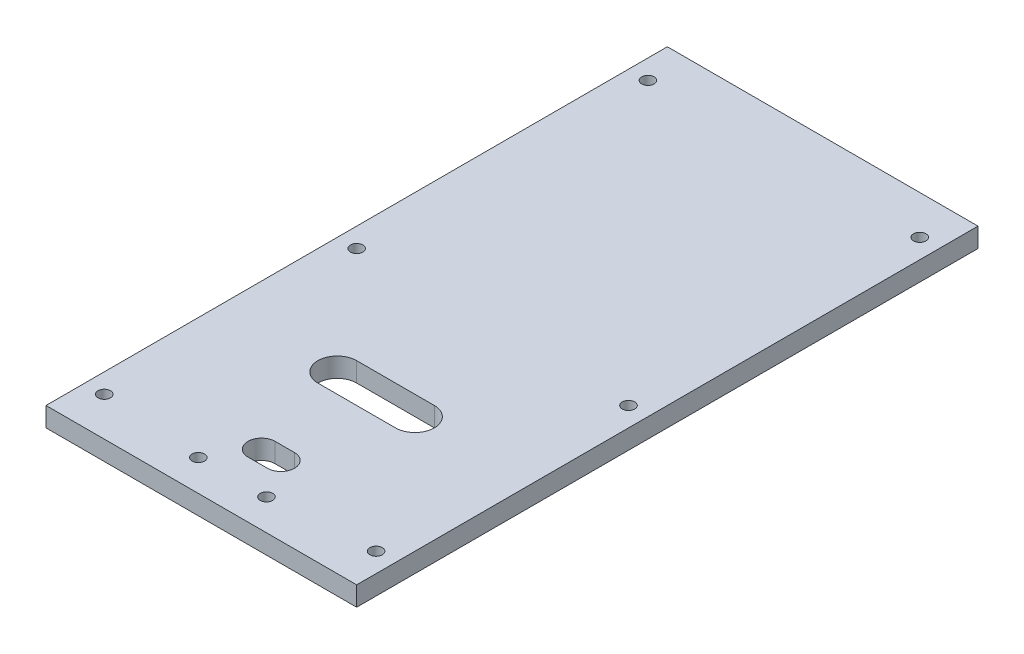
ISO-10303-21;
HEADER;
FILE_DESCRIPTION(('STEP AP214'),'2;1');
FILE_NAME('part.step','',(''),(''),'','','');
FILE_SCHEMA(('AUTOMOTIVE_DESIGN { 1 0 10303 214 1 1 1 1 }'));
ENDSEC;
DATA;
#1=APPLICATION_CONTEXT('core data for automotive mechanical design processes');
#2=APPLICATION_PROTOCOL_DEFINITION('international standard','automotive_design',2000,#1);
#3=PRODUCT_CONTEXT('',#1,'mechanical');
#4=PRODUCT('Part','Part','',(#3));
#5=PRODUCT_RELATED_PRODUCT_CATEGORY('part','',(#4));
#6=PRODUCT_DEFINITION_FORMATION('','',#4);
#7=PRODUCT_DEFINITION_CONTEXT('part definition',#1,'design');
#8=PRODUCT_DEFINITION('design','',#6,#7);
#9=PRODUCT_DEFINITION_SHAPE('','',#8);
#10=(LENGTH_UNIT() NAMED_UNIT(*) SI_UNIT(.MILLI.,.METRE.));
#11=(NAMED_UNIT(*) PLANE_ANGLE_UNIT() SI_UNIT($,.RADIAN.));
#12=(NAMED_UNIT(*) SI_UNIT($,.STERADIAN.) SOLID_ANGLE_UNIT());
#13=UNCERTAINTY_MEASURE_WITH_UNIT(LENGTH_MEASURE(1.E-05),#10,'distance_accuracy_value','');
#14=(GEOMETRIC_REPRESENTATION_CONTEXT(3) GLOBAL_UNCERTAINTY_ASSIGNED_CONTEXT((#13)) GLOBAL_UNIT_ASSIGNED_CONTEXT((#10,
#11,#12)) REPRESENTATION_CONTEXT('',''));
#15=CARTESIAN_POINT('',(0.,0.,0.));
#16=DIRECTION('',(0.,0.,1.));
#17=DIRECTION('',(1.,0.,0.));
#18=AXIS2_PLACEMENT_3D('',#15,#16,#17);
#19=CARTESIAN_POINT('',(0.,5.,0.));
#20=DIRECTION('',(1.,0.,0.));
#21=DIRECTION('',(0.,0.,-1.));
#22=AXIS2_PLACEMENT_3D('',#19,#20,#21);
#23=PLANE('',#22);
#24=DIRECTION('',(0.,0.,1.));
#25=VECTOR('',#24,1.);
#26=CARTESIAN_POINT('',(0.,0.,0.));
#27=LINE('',#26,#25);
#28=CARTESIAN_POINT('',(0.,0.,-160.));
#29=VERTEX_POINT('',#28);
#30=CARTESIAN_POINT('',(0.,0.,0.));
#31=VERTEX_POINT('',#30);
#32=EDGE_CURVE('E237',#29,#31,#27,.T.);
#33=ORIENTED_EDGE('',*,*,#32,.T.);
#34=DIRECTION('',(0.,-1.,0.));
#35=VECTOR('',#34,1.);
#36=CARTESIAN_POINT('',(0.,5.,0.));
#37=LINE('',#36,#35);
#38=CARTESIAN_POINT('',(0.,5.,0.));
#39=VERTEX_POINT('',#38);
#40=EDGE_CURVE('E11',#39,#31,#37,.T.);
#41=ORIENTED_EDGE('',*,*,#40,.F.);
#42=DIRECTION('',(0.,0.,1.));
#43=VECTOR('',#42,1.);
#44=CARTESIAN_POINT('',(0.,5.,0.));
#45=LINE('',#44,#43);
#46=CARTESIAN_POINT('',(0.,5.,-160.));
#47=VERTEX_POINT('',#46);
#48=EDGE_CURVE('E238',#47,#39,#45,.T.);
#49=ORIENTED_EDGE('',*,*,#48,.F.);
#50=DIRECTION('',(0.,-1.,0.));
#51=VECTOR('',#50,1.);
#52=CARTESIAN_POINT('',(0.,5.,-160.));
#53=LINE('',#52,#51);
#54=EDGE_CURVE('E248',#47,#29,#53,.T.);
#55=ORIENTED_EDGE('',*,*,#54,.T.);
#56=EDGE_LOOP('',(#33,#41,#49,#55));
#57=FACE_BOUND('',#56,.T.);
#58=ADVANCED_FACE('F32',(#57),#23,.F.);
#59=CARTESIAN_POINT('',(0.,5.,0.));
#60=DIRECTION('',(0.,0.,-1.));
#61=DIRECTION('',(-1.,0.,0.));
#62=AXIS2_PLACEMENT_3D('',#59,#60,#61);
#63=PLANE('',#62);
#64=DIRECTION('',(1.,0.,0.));
#65=VECTOR('',#64,1.);
#66=CARTESIAN_POINT('',(0.,0.,0.));
#67=LINE('',#66,#65);
#68=CARTESIAN_POINT('',(80.,0.,0.));
#69=VERTEX_POINT('',#68);
#70=EDGE_CURVE('E251',#31,#69,#67,.T.);
#71=ORIENTED_EDGE('',*,*,#70,.T.);
#72=DIRECTION('',(0.,-1.,0.));
#73=VECTOR('',#72,1.);
#74=CARTESIAN_POINT('',(80.,5.,0.));
#75=LINE('',#74,#73);
#76=CARTESIAN_POINT('',(80.,5.,0.));
#77=VERTEX_POINT('',#76);
#78=EDGE_CURVE('E39',#77,#69,#75,.T.);
#79=ORIENTED_EDGE('',*,*,#78,.F.);
#80=DIRECTION('',(1.,0.,0.));
#81=VECTOR('',#80,1.);
#82=CARTESIAN_POINT('',(0.,5.,0.));
#83=LINE('',#82,#81);
#84=EDGE_CURVE('E241',#39,#77,#83,.T.);
#85=ORIENTED_EDGE('',*,*,#84,.F.);
#86=ORIENTED_EDGE('',*,*,#40,.T.);
#87=EDGE_LOOP('',(#71,#79,#85,#86));
#88=FACE_BOUND('',#87,.T.);
#89=ADVANCED_FACE('F280',(#88),#63,.F.);
#90=CARTESIAN_POINT('',(80.,5.,0.));
#91=DIRECTION('',(-1.,0.,0.));
#92=DIRECTION('',(0.,0.,1.));
#93=AXIS2_PLACEMENT_3D('',#90,#91,#92);
#94=PLANE('',#93);
#95=DIRECTION('',(0.,0.,-1.));
#96=VECTOR('',#95,1.);
#97=CARTESIAN_POINT('',(80.,0.,0.));
#98=LINE('',#97,#96);
#99=CARTESIAN_POINT('',(80.,0.,-160.));
#100=VERTEX_POINT('',#99);
#101=EDGE_CURVE('E253',#69,#100,#98,.T.);
#102=ORIENTED_EDGE('',*,*,#101,.T.);
#103=DIRECTION('',(0.,-1.,0.));
#104=VECTOR('',#103,1.);
#105=CARTESIAN_POINT('',(80.,5.,-160.));
#106=LINE('',#105,#104);
#107=CARTESIAN_POINT('',(80.,5.,-160.));
#108=VERTEX_POINT('',#107);
#109=EDGE_CURVE('E258',#108,#100,#106,.T.);
#110=ORIENTED_EDGE('',*,*,#109,.F.);
#111=DIRECTION('',(0.,0.,-1.));
#112=VECTOR('',#111,1.);
#113=CARTESIAN_POINT('',(80.,5.,0.));
#114=LINE('',#113,#112);
#115=EDGE_CURVE('E244',#77,#108,#114,.T.);
#116=ORIENTED_EDGE('',*,*,#115,.F.);
#117=ORIENTED_EDGE('',*,*,#78,.T.);
#118=EDGE_LOOP('',(#102,#110,#116,#117));
#119=FACE_BOUND('',#118,.T.);
#120=ADVANCED_FACE('F265',(#119),#94,.F.);
#121=CARTESIAN_POINT('',(0.,5.,-160.));
#122=DIRECTION('',(0.,0.,1.));
#123=DIRECTION('',(1.,0.,0.));
#124=AXIS2_PLACEMENT_3D('',#121,#122,#123);
#125=PLANE('',#124);
#126=DIRECTION('',(-1.,0.,0.));
#127=VECTOR('',#126,1.);
#128=CARTESIAN_POINT('',(0.,0.,-160.));
#129=LINE('',#128,#127);
#130=EDGE_CURVE('E242',#100,#29,#129,.T.);
#131=ORIENTED_EDGE('',*,*,#130,.T.);
#132=ORIENTED_EDGE('',*,*,#54,.F.);
#133=DIRECTION('',(-1.,0.,0.));
#134=VECTOR('',#133,1.);
#135=CARTESIAN_POINT('',(0.,5.,-160.));
#136=LINE('',#135,#134);
#137=EDGE_CURVE('E246',#108,#47,#136,.T.);
#138=ORIENTED_EDGE('',*,*,#137,.F.);
#139=ORIENTED_EDGE('',*,*,#109,.T.);
#140=EDGE_LOOP('',(#131,#132,#138,#139));
#141=FACE_BOUND('',#140,.T.);
#142=ADVANCED_FACE('F273',(#141),#125,.F.);
#143=CARTESIAN_POINT('',(0.,5.,0.));
#144=DIRECTION('',(0.,-1.,0.));
#145=DIRECTION('',(0.,0.,-1.));
#146=AXIS2_PLACEMENT_3D('',#143,#144,#145);
#147=PLANE('',#146);
#148=DIRECTION('',(1.,0.,0.));
#149=VECTOR('',#148,1.);
#150=CARTESIAN_POINT('',(37.5,5.,-14.5));
#151=LINE('',#150,#149);
#152=CARTESIAN_POINT('',(37.5,5.,-14.5));
#153=VERTEX_POINT('',#152);
#154=CARTESIAN_POINT('',(42.5,5.,-14.5));
#155=VERTEX_POINT('',#154);
#156=EDGE_CURVE('E150',#153,#155,#151,.T.);
#157=ORIENTED_EDGE('',*,*,#156,.F.);
#158=CARTESIAN_POINT('',(37.5,5.,-18.));
#159=DIRECTION('',(0.,1.,0.));
#160=DIRECTION('',(0.,0.,1.));
#161=AXIS2_PLACEMENT_3D('',#158,#159,#160);
#162=CIRCLE('',#161,3.5);
#163=CARTESIAN_POINT('',(37.5,5.,-21.5));
#164=VERTEX_POINT('',#163);
#165=EDGE_CURVE('E46',#164,#153,#162,.T.);
#166=ORIENTED_EDGE('',*,*,#165,.F.);
#167=DIRECTION('',(-1.,0.,0.));
#168=VECTOR('',#167,1.);
#169=CARTESIAN_POINT('',(37.5,5.,-21.5));
#170=LINE('',#169,#168);
#171=CARTESIAN_POINT('',(42.5,5.,-21.5));
#172=VERTEX_POINT('',#171);
#173=EDGE_CURVE('E141',#172,#164,#170,.T.);
#174=ORIENTED_EDGE('',*,*,#173,.F.);
#175=CARTESIAN_POINT('',(42.5,5.,-18.));
#176=DIRECTION('',(0.,1.,0.));
#177=DIRECTION('',(0.,0.,1.));
#178=AXIS2_PLACEMENT_3D('',#175,#176,#177);
#179=CIRCLE('',#178,3.5);
#180=EDGE_CURVE('E144',#155,#172,#179,.T.);
#181=ORIENTED_EDGE('',*,*,#180,.F.);
#182=EDGE_LOOP('',(#157,#166,#174,#181));
#183=FACE_BOUND('',#182,.T.);
#184=DIRECTION('',(1.,0.,0.));
#185=VECTOR('',#184,1.);
#186=CARTESIAN_POINT('',(30.,5.,-40.));
#187=LINE('',#186,#185);
#188=CARTESIAN_POINT('',(30.,5.,-40.));
#189=VERTEX_POINT('',#188);
#190=CARTESIAN_POINT('',(50.,5.,-40.));
#191=VERTEX_POINT('',#190);
#192=EDGE_CURVE('E176',#189,#191,#187,.T.);
#193=ORIENTED_EDGE('',*,*,#192,.F.);
#194=CARTESIAN_POINT('',(30.,5.,-45.));
#195=DIRECTION('',(0.,1.,0.));
#196=DIRECTION('',(0.,0.,1.));
#197=AXIS2_PLACEMENT_3D('',#194,#195,#196);
#198=CIRCLE('',#197,5.00000000000001);
#199=CARTESIAN_POINT('',(30.,5.,-50.));
#200=VERTEX_POINT('',#199);
#201=EDGE_CURVE('E54',#200,#189,#198,.T.);
#202=ORIENTED_EDGE('',*,*,#201,.F.);
#203=DIRECTION('',(-1.,0.,0.));
#204=VECTOR('',#203,1.);
#205=CARTESIAN_POINT('',(30.,5.,-50.));
#206=LINE('',#205,#204);
#207=CARTESIAN_POINT('',(50.,5.,-50.));
#208=VERTEX_POINT('',#207);
#209=EDGE_CURVE('E165',#208,#200,#206,.T.);
#210=ORIENTED_EDGE('',*,*,#209,.F.);
#211=CARTESIAN_POINT('',(50.,5.,-45.));
#212=DIRECTION('',(0.,1.,0.));
#213=DIRECTION('',(0.,0.,1.));
#214=AXIS2_PLACEMENT_3D('',#211,#212,#213);
#215=CIRCLE('',#214,5.00000000000001);
#216=EDGE_CURVE('E179',#191,#208,#215,.T.);
#217=ORIENTED_EDGE('',*,*,#216,.F.);
#218=EDGE_LOOP('',(#193,#202,#210,#217));
#219=FACE_BOUND('',#218,.T.);
#220=CARTESIAN_POINT('',(31.225,5.,-8.00000000000001));
#221=DIRECTION('',(0.,-1.,0.));
#222=DIRECTION('',(0.,0.,-1.));
#223=AXIS2_PLACEMENT_3D('',#220,#221,#222);
#224=CIRCLE('',#223,1.60000000000001);
#225=CARTESIAN_POINT('',(31.225,5.,-9.60000000000002));
#226=VERTEX_POINT('',#225);
#227=EDGE_CURVE('E198',#226,#226,#224,.F.);
#228=ORIENTED_EDGE('',*,*,#227,.F.);
#229=EDGE_LOOP('',(#228));
#230=FACE_BOUND('',#229,.T.);
#231=CARTESIAN_POINT('',(48.775,5.,-8.00000000000001));
#232=DIRECTION('',(0.,-1.,0.));
#233=DIRECTION('',(0.,0.,-1.));
#234=AXIS2_PLACEMENT_3D('',#231,#232,#233);
#235=CIRCLE('',#234,1.6);
#236=CARTESIAN_POINT('',(48.775,5.,-9.60000000000002));
#237=VERTEX_POINT('',#236);
#238=EDGE_CURVE('E193',#237,#237,#235,.F.);
#239=ORIENTED_EDGE('',*,*,#238,.F.);
#240=EDGE_LOOP('',(#239));
#241=FACE_BOUND('',#240,.T.);
#242=CARTESIAN_POINT('',(75.,5.,-150.));
#243=DIRECTION('',(0.,-1.,0.));
#244=DIRECTION('',(0.,0.,-1.));
#245=AXIS2_PLACEMENT_3D('',#242,#243,#244);
#246=CIRCLE('',#245,1.6);
#247=CARTESIAN_POINT('',(75.,5.,-151.6));
#248=VERTEX_POINT('',#247);
#249=EDGE_CURVE('E234',#248,#248,#246,.F.);
#250=ORIENTED_EDGE('',*,*,#249,.F.);
#251=EDGE_LOOP('',(#250));
#252=FACE_BOUND('',#251,.T.);
#253=CARTESIAN_POINT('',(75.,5.,-75.));
#254=DIRECTION('',(0.,-1.,0.));
#255=DIRECTION('',(0.,0.,-1.));
#256=AXIS2_PLACEMENT_3D('',#253,#254,#255);
#257=CIRCLE('',#256,1.59999999999999);
#258=CARTESIAN_POINT('',(75.,5.,-76.6));
#259=VERTEX_POINT('',#258);
#260=EDGE_CURVE('E231',#259,#259,#257,.F.);
#261=ORIENTED_EDGE('',*,*,#260,.F.);
#262=EDGE_LOOP('',(#261));
#263=FACE_BOUND('',#262,.T.);
#264=CARTESIAN_POINT('',(75.,5.,-10.));
#265=DIRECTION('',(0.,-1.,0.));
#266=DIRECTION('',(0.,0.,-1.));
#267=AXIS2_PLACEMENT_3D('',#264,#265,#266);
#268=CIRCLE('',#267,1.59999999999999);
#269=CARTESIAN_POINT('',(75.,5.,-11.6));
#270=VERTEX_POINT('',#269);
#271=EDGE_CURVE('E228',#270,#270,#268,.F.);
#272=ORIENTED_EDGE('',*,*,#271,.F.);
#273=EDGE_LOOP('',(#272));
#274=FACE_BOUND('',#273,.T.);
#275=CARTESIAN_POINT('',(5.00000000000002,5.,-10.));
#276=DIRECTION('',(0.,-1.,0.));
#277=DIRECTION('',(0.,0.,-1.));
#278=AXIS2_PLACEMENT_3D('',#275,#276,#277);
#279=CIRCLE('',#278,1.6);
#280=CARTESIAN_POINT('',(5.00000000000002,5.,-11.6));
#281=VERTEX_POINT('',#280);
#282=EDGE_CURVE('E225',#281,#281,#279,.F.);
#283=ORIENTED_EDGE('',*,*,#282,.F.);
#284=EDGE_LOOP('',(#283));
#285=FACE_BOUND('',#284,.T.);
#286=CARTESIAN_POINT('',(5.00000000000001,5.,-75.));
#287=DIRECTION('',(0.,-1.,0.));
#288=DIRECTION('',(0.,0.,-1.));
#289=AXIS2_PLACEMENT_3D('',#286,#287,#288);
#290=CIRCLE('',#289,1.6);
#291=CARTESIAN_POINT('',(5.00000000000001,5.,-76.6));
#292=VERTEX_POINT('',#291);
#293=EDGE_CURVE('E222',#292,#292,#290,.F.);
#294=ORIENTED_EDGE('',*,*,#293,.F.);
#295=EDGE_LOOP('',(#294));
#296=FACE_BOUND('',#295,.T.);
#297=CARTESIAN_POINT('',(5.,5.,-150.));
#298=DIRECTION('',(0.,-1.,0.));
#299=DIRECTION('',(0.,0.,-1.));
#300=AXIS2_PLACEMENT_3D('',#297,#298,#299);
#301=CIRCLE('',#300,1.59999999999999);
#302=CARTESIAN_POINT('',(5.,5.,-151.6));
#303=VERTEX_POINT('',#302);
#304=EDGE_CURVE('E219',#303,#303,#301,.F.);
#305=ORIENTED_EDGE('',*,*,#304,.F.);
#306=EDGE_LOOP('',(#305));
#307=FACE_BOUND('',#306,.T.);
#308=ORIENTED_EDGE('',*,*,#48,.T.);
#309=ORIENTED_EDGE('',*,*,#84,.T.);
#310=ORIENTED_EDGE('',*,*,#115,.T.);
#311=ORIENTED_EDGE('',*,*,#137,.T.);
#312=EDGE_LOOP('',(#308,#309,#310,#311));
#313=FACE_BOUND('',#312,.T.);
#314=ADVANCED_FACE('F279',(#183,#219,#230,#241,#252,#263,#274,#285,#296,#307,#313),#147,.F.);
#315=CARTESIAN_POINT('',(0.,0.,0.));
#316=DIRECTION('',(0.,-1.,0.));
#317=DIRECTION('',(0.,0.,-1.));
#318=AXIS2_PLACEMENT_3D('',#315,#316,#317);
#319=PLANE('',#318);
#320=CARTESIAN_POINT('',(37.5,0.,-18.));
#321=DIRECTION('',(0.,1.,0.));
#322=DIRECTION('',(0.,0.,1.));
#323=AXIS2_PLACEMENT_3D('',#320,#321,#322);
#324=CIRCLE('',#323,3.5);
#325=CARTESIAN_POINT('',(37.5,0.,-21.5));
#326=VERTEX_POINT('',#325);
#327=CARTESIAN_POINT('',(37.5,0.,-14.5));
#328=VERTEX_POINT('',#327);
#329=EDGE_CURVE('E122',#326,#328,#324,.T.);
#330=ORIENTED_EDGE('',*,*,#329,.T.);
#331=DIRECTION('',(1.,0.,0.));
#332=VECTOR('',#331,1.);
#333=CARTESIAN_POINT('',(37.5,0.,-14.5));
#334=LINE('',#333,#332);
#335=CARTESIAN_POINT('',(42.5,0.,-14.5));
#336=VERTEX_POINT('',#335);
#337=EDGE_CURVE('E132',#328,#336,#334,.T.);
#338=ORIENTED_EDGE('',*,*,#337,.T.);
#339=CARTESIAN_POINT('',(42.5,0.,-18.));
#340=DIRECTION('',(0.,1.,0.));
#341=DIRECTION('',(0.,0.,1.));
#342=AXIS2_PLACEMENT_3D('',#339,#340,#341);
#343=CIRCLE('',#342,3.5);
#344=CARTESIAN_POINT('',(42.5,0.,-21.5));
#345=VERTEX_POINT('',#344);
#346=EDGE_CURVE('E136',#336,#345,#343,.T.);
#347=ORIENTED_EDGE('',*,*,#346,.T.);
#348=DIRECTION('',(-1.,0.,0.));
#349=VECTOR('',#348,1.);
#350=CARTESIAN_POINT('',(37.5,0.,-21.5));
#351=LINE('',#350,#349);
#352=EDGE_CURVE('E128',#345,#326,#351,.T.);
#353=ORIENTED_EDGE('',*,*,#352,.T.);
#354=EDGE_LOOP('',(#330,#338,#347,#353));
#355=FACE_BOUND('',#354,.T.);
#356=CARTESIAN_POINT('',(30.,0.,-45.));
#357=DIRECTION('',(0.,1.,0.));
#358=DIRECTION('',(0.,0.,1.));
#359=AXIS2_PLACEMENT_3D('',#356,#357,#358);
#360=CIRCLE('',#359,5.00000000000001);
#361=CARTESIAN_POINT('',(30.,0.,-50.));
#362=VERTEX_POINT('',#361);
#363=CARTESIAN_POINT('',(30.,0.,-40.));
#364=VERTEX_POINT('',#363);
#365=EDGE_CURVE('E161',#362,#364,#360,.T.);
#366=ORIENTED_EDGE('',*,*,#365,.T.);
#367=DIRECTION('',(1.,0.,0.));
#368=VECTOR('',#367,1.);
#369=CARTESIAN_POINT('',(30.,0.,-40.));
#370=LINE('',#369,#368);
#371=CARTESIAN_POINT('',(50.,0.,-40.));
#372=VERTEX_POINT('',#371);
#373=EDGE_CURVE('E164',#364,#372,#370,.T.);
#374=ORIENTED_EDGE('',*,*,#373,.T.);
#375=CARTESIAN_POINT('',(50.,0.,-45.));
#376=DIRECTION('',(0.,1.,0.));
#377=DIRECTION('',(0.,0.,1.));
#378=AXIS2_PLACEMENT_3D('',#375,#376,#377);
#379=CIRCLE('',#378,5.00000000000001);
#380=CARTESIAN_POINT('',(50.,0.,-50.));
#381=VERTEX_POINT('',#380);
#382=EDGE_CURVE('E168',#372,#381,#379,.T.);
#383=ORIENTED_EDGE('',*,*,#382,.T.);
#384=DIRECTION('',(-1.,0.,0.));
#385=VECTOR('',#384,1.);
#386=CARTESIAN_POINT('',(30.,0.,-50.));
#387=LINE('',#386,#385);
#388=EDGE_CURVE('E171',#381,#362,#387,.T.);
#389=ORIENTED_EDGE('',*,*,#388,.T.);
#390=EDGE_LOOP('',(#366,#374,#383,#389));
#391=FACE_BOUND('',#390,.T.);
#392=CARTESIAN_POINT('',(31.225,0.,-8.00000000000001));
#393=DIRECTION('',(0.,1.,0.));
#394=DIRECTION('',(0.,0.,1.));
#395=AXIS2_PLACEMENT_3D('',#392,#393,#394);
#396=CIRCLE('',#395,1.60000000000001);
#397=CARTESIAN_POINT('',(31.225,0.,-6.4));
#398=VERTEX_POINT('',#397);
#399=EDGE_CURVE('E190',#398,#398,#396,.T.);
#400=ORIENTED_EDGE('',*,*,#399,.T.);
#401=EDGE_LOOP('',(#400));
#402=FACE_BOUND('',#401,.T.);
#403=CARTESIAN_POINT('',(48.775,0.,-8.00000000000001));
#404=DIRECTION('',(0.,1.,0.));
#405=DIRECTION('',(0.,0.,-1.));
#406=AXIS2_PLACEMENT_3D('',#403,#404,#405);
#407=CIRCLE('',#406,1.6);
#408=CARTESIAN_POINT('',(48.775,0.,-9.60000000000002));
#409=VERTEX_POINT('',#408);
#410=EDGE_CURVE('E157',#409,#409,#407,.T.);
#411=ORIENTED_EDGE('',*,*,#410,.T.);
#412=EDGE_LOOP('',(#411));
#413=FACE_BOUND('',#412,.T.);
#414=CARTESIAN_POINT('',(75.,0.,-150.));
#415=DIRECTION('',(0.,1.,0.));
#416=DIRECTION('',(0.,0.,-1.));
#417=AXIS2_PLACEMENT_3D('',#414,#415,#416);
#418=CIRCLE('',#417,1.6);
#419=CARTESIAN_POINT('',(75.,0.,-151.6));
#420=VERTEX_POINT('',#419);
#421=EDGE_CURVE('E201',#420,#420,#418,.T.);
#422=ORIENTED_EDGE('',*,*,#421,.T.);
#423=EDGE_LOOP('',(#422));
#424=FACE_BOUND('',#423,.T.);
#425=CARTESIAN_POINT('',(75.,0.,-75.));
#426=DIRECTION('',(0.,1.,0.));
#427=DIRECTION('',(0.,0.,-1.));
#428=AXIS2_PLACEMENT_3D('',#425,#426,#427);
#429=CIRCLE('',#428,1.59999999999999);
#430=CARTESIAN_POINT('',(75.,0.,-76.6));
#431=VERTEX_POINT('',#430);
#432=EDGE_CURVE('E212',#431,#431,#429,.T.);
#433=ORIENTED_EDGE('',*,*,#432,.T.);
#434=EDGE_LOOP('',(#433));
#435=FACE_BOUND('',#434,.T.);
#436=CARTESIAN_POINT('',(75.,0.,-10.));
#437=DIRECTION('',(0.,1.,0.));
#438=DIRECTION('',(0.,0.,-1.));
#439=AXIS2_PLACEMENT_3D('',#436,#437,#438);
#440=CIRCLE('',#439,1.59999999999999);
#441=CARTESIAN_POINT('',(75.,0.,-11.6));
#442=VERTEX_POINT('',#441);
#443=EDGE_CURVE('E209',#442,#442,#440,.T.);
#444=ORIENTED_EDGE('',*,*,#443,.T.);
#445=EDGE_LOOP('',(#444));
#446=FACE_BOUND('',#445,.T.);
#447=CARTESIAN_POINT('',(5.00000000000002,0.,-10.));
#448=DIRECTION('',(0.,1.,0.));
#449=DIRECTION('',(0.,0.,1.));
#450=AXIS2_PLACEMENT_3D('',#447,#448,#449);
#451=CIRCLE('',#450,1.6);
#452=CARTESIAN_POINT('',(5.00000000000002,0.,-8.40000000000001));
#453=VERTEX_POINT('',#452);
#454=EDGE_CURVE('E206',#453,#453,#451,.T.);
#455=ORIENTED_EDGE('',*,*,#454,.T.);
#456=EDGE_LOOP('',(#455));
#457=FACE_BOUND('',#456,.T.);
#458=CARTESIAN_POINT('',(5.00000000000001,0.,-75.));
#459=DIRECTION('',(0.,1.,0.));
#460=DIRECTION('',(0.,0.,1.));
#461=AXIS2_PLACEMENT_3D('',#458,#459,#460);
#462=CIRCLE('',#461,1.6);
#463=CARTESIAN_POINT('',(5.00000000000001,0.,-73.4));
#464=VERTEX_POINT('',#463);
#465=EDGE_CURVE('E202',#464,#464,#462,.T.);
#466=ORIENTED_EDGE('',*,*,#465,.T.);
#467=EDGE_LOOP('',(#466));
#468=FACE_BOUND('',#467,.T.);
#469=CARTESIAN_POINT('',(5.,0.,-150.));
#470=DIRECTION('',(0.,1.,0.));
#471=DIRECTION('',(0.,0.,1.));
#472=AXIS2_PLACEMENT_3D('',#469,#470,#471);
#473=CIRCLE('',#472,1.59999999999999);
#474=CARTESIAN_POINT('',(5.,0.,-148.4));
#475=VERTEX_POINT('',#474);
#476=EDGE_CURVE('E205',#475,#475,#473,.T.);
#477=ORIENTED_EDGE('',*,*,#476,.T.);
#478=EDGE_LOOP('',(#477));
#479=FACE_BOUND('',#478,.T.);
#480=ORIENTED_EDGE('',*,*,#32,.F.);
#481=ORIENTED_EDGE('',*,*,#130,.F.);
#482=ORIENTED_EDGE('',*,*,#101,.F.);
#483=ORIENTED_EDGE('',*,*,#70,.F.);
#484=EDGE_LOOP('',(#480,#481,#482,#483));
#485=FACE_BOUND('',#484,.T.);
#486=ADVANCED_FACE('F138',(#355,#391,#402,#413,#424,#435,#446,#457,#468,#479,#485),#319,.T.);
#487=CARTESIAN_POINT('',(5.,10.,-150.));
#488=DIRECTION('',(0.,-1.,0.));
#489=DIRECTION('',(0.,0.,-1.));
#490=AXIS2_PLACEMENT_3D('',#487,#488,#489);
#491=CYLINDRICAL_SURFACE('',#490,1.59999999999999);
#492=ORIENTED_EDGE('',*,*,#476,.F.);
#493=EDGE_LOOP('',(#492));
#494=FACE_BOUND('',#493,.T.);
#495=ORIENTED_EDGE('',*,*,#304,.T.);
#496=EDGE_LOOP('',(#495));
#497=FACE_BOUND('',#496,.T.);
#498=ADVANCED_FACE('F292',(#494,#497),#491,.F.);
#499=CARTESIAN_POINT('',(5.00000000000001,10.,-75.));
#500=DIRECTION('',(0.,-1.,0.));
#501=DIRECTION('',(0.,0.,-1.));
#502=AXIS2_PLACEMENT_3D('',#499,#500,#501);
#503=CYLINDRICAL_SURFACE('',#502,1.6);
#504=ORIENTED_EDGE('',*,*,#465,.F.);
#505=EDGE_LOOP('',(#504));
#506=FACE_BOUND('',#505,.T.);
#507=ORIENTED_EDGE('',*,*,#293,.T.);
#508=EDGE_LOOP('',(#507));
#509=FACE_BOUND('',#508,.T.);
#510=ADVANCED_FACE('F298',(#506,#509),#503,.F.);
#511=CARTESIAN_POINT('',(5.00000000000002,10.,-10.));
#512=DIRECTION('',(0.,-1.,0.));
#513=DIRECTION('',(0.,0.,-1.));
#514=AXIS2_PLACEMENT_3D('',#511,#512,#513);
#515=CYLINDRICAL_SURFACE('',#514,1.6);
#516=ORIENTED_EDGE('',*,*,#454,.F.);
#517=EDGE_LOOP('',(#516));
#518=FACE_BOUND('',#517,.T.);
#519=ORIENTED_EDGE('',*,*,#282,.T.);
#520=EDGE_LOOP('',(#519));
#521=FACE_BOUND('',#520,.T.);
#522=ADVANCED_FACE('F312',(#518,#521),#515,.F.);
#523=CARTESIAN_POINT('',(75.,10.,-10.));
#524=DIRECTION('',(0.,-1.,0.));
#525=DIRECTION('',(0.,0.,-1.));
#526=AXIS2_PLACEMENT_3D('',#523,#524,#525);
#527=CYLINDRICAL_SURFACE('',#526,1.59999999999999);
#528=ORIENTED_EDGE('',*,*,#443,.F.);
#529=EDGE_LOOP('',(#528));
#530=FACE_BOUND('',#529,.T.);
#531=ORIENTED_EDGE('',*,*,#271,.T.);
#532=EDGE_LOOP('',(#531));
#533=FACE_BOUND('',#532,.T.);
#534=ADVANCED_FACE('F308',(#530,#533),#527,.F.);
#535=CARTESIAN_POINT('',(75.,10.,-75.));
#536=DIRECTION('',(0.,-1.,0.));
#537=DIRECTION('',(0.,0.,-1.));
#538=AXIS2_PLACEMENT_3D('',#535,#536,#537);
#539=CYLINDRICAL_SURFACE('',#538,1.59999999999999);
#540=ORIENTED_EDGE('',*,*,#432,.F.);
#541=EDGE_LOOP('',(#540));
#542=FACE_BOUND('',#541,.T.);
#543=ORIENTED_EDGE('',*,*,#260,.T.);
#544=EDGE_LOOP('',(#543));
#545=FACE_BOUND('',#544,.T.);
#546=ADVANCED_FACE('F304',(#542,#545),#539,.F.);
#547=CARTESIAN_POINT('',(75.,10.,-150.));
#548=DIRECTION('',(0.,-1.,0.));
#549=DIRECTION('',(0.,0.,-1.));
#550=AXIS2_PLACEMENT_3D('',#547,#548,#549);
#551=CYLINDRICAL_SURFACE('',#550,1.6);
#552=ORIENTED_EDGE('',*,*,#421,.F.);
#553=EDGE_LOOP('',(#552));
#554=FACE_BOUND('',#553,.T.);
#555=ORIENTED_EDGE('',*,*,#249,.T.);
#556=EDGE_LOOP('',(#555));
#557=FACE_BOUND('',#556,.T.);
#558=ADVANCED_FACE('F300',(#554,#557),#551,.F.);
#559=CARTESIAN_POINT('',(48.775,10.,-8.00000000000001));
#560=DIRECTION('',(0.,-1.,0.));
#561=DIRECTION('',(0.,0.,-1.));
#562=AXIS2_PLACEMENT_3D('',#559,#560,#561);
#563=CYLINDRICAL_SURFACE('',#562,1.6);
#564=ORIENTED_EDGE('',*,*,#410,.F.);
#565=EDGE_LOOP('',(#564));
#566=FACE_BOUND('',#565,.T.);
#567=ORIENTED_EDGE('',*,*,#238,.T.);
#568=EDGE_LOOP('',(#567));
#569=FACE_BOUND('',#568,.T.);
#570=ADVANCED_FACE('F303',(#566,#569),#563,.F.);
#571=CARTESIAN_POINT('',(31.225,10.,-8.00000000000001));
#572=DIRECTION('',(0.,-1.,0.));
#573=DIRECTION('',(0.,0.,-1.));
#574=AXIS2_PLACEMENT_3D('',#571,#572,#573);
#575=CYLINDRICAL_SURFACE('',#574,1.60000000000001);
#576=ORIENTED_EDGE('',*,*,#399,.F.);
#577=EDGE_LOOP('',(#576));
#578=FACE_BOUND('',#577,.T.);
#579=ORIENTED_EDGE('',*,*,#227,.T.);
#580=EDGE_LOOP('',(#579));
#581=FACE_BOUND('',#580,.T.);
#582=ADVANCED_FACE('F322',(#578,#581),#575,.F.);
#583=CARTESIAN_POINT('',(30.,0.,-45.));
#584=DIRECTION('',(0.,1.,0.));
#585=DIRECTION('',(0.,0.,1.));
#586=AXIS2_PLACEMENT_3D('',#583,#584,#585);
#587=CYLINDRICAL_SURFACE('',#586,5.00000000000001);
#588=ORIENTED_EDGE('',*,*,#201,.T.);
#589=DIRECTION('',(0.,1.,0.));
#590=VECTOR('',#589,1.);
#591=CARTESIAN_POINT('',(30.,0.,-40.));
#592=LINE('',#591,#590);
#593=EDGE_CURVE('E174',#364,#189,#592,.T.);
#594=ORIENTED_EDGE('',*,*,#593,.F.);
#595=ORIENTED_EDGE('',*,*,#365,.F.);
#596=DIRECTION('',(0.,1.,0.));
#597=VECTOR('',#596,1.);
#598=CARTESIAN_POINT('',(30.,0.,-50.));
#599=LINE('',#598,#597);
#600=EDGE_CURVE('E151',#362,#200,#599,.T.);
#601=ORIENTED_EDGE('',*,*,#600,.T.);
#602=EDGE_LOOP('',(#588,#594,#595,#601));
#603=FACE_BOUND('',#602,.T.);
#604=ADVANCED_FACE('F326',(#603),#587,.F.);
#605=CARTESIAN_POINT('',(30.,0.,-50.));
#606=DIRECTION('',(0.,0.,-1.));
#607=DIRECTION('',(-1.,0.,0.));
#608=AXIS2_PLACEMENT_3D('',#605,#606,#607);
#609=PLANE('',#608);
#610=ORIENTED_EDGE('',*,*,#209,.T.);
#611=ORIENTED_EDGE('',*,*,#600,.F.);
#612=ORIENTED_EDGE('',*,*,#388,.F.);
#613=DIRECTION('',(0.,1.,0.));
#614=VECTOR('',#613,1.);
#615=CARTESIAN_POINT('',(50.,0.,-50.));
#616=LINE('',#615,#614);
#617=EDGE_CURVE('E185',#381,#208,#616,.T.);
#618=ORIENTED_EDGE('',*,*,#617,.T.);
#619=EDGE_LOOP('',(#610,#611,#612,#618));
#620=FACE_BOUND('',#619,.T.);
#621=ADVANCED_FACE('F330',(#620),#609,.F.);
#622=CARTESIAN_POINT('',(50.,0.,-45.));
#623=DIRECTION('',(0.,1.,0.));
#624=DIRECTION('',(0.,0.,1.));
#625=AXIS2_PLACEMENT_3D('',#622,#623,#624);
#626=CYLINDRICAL_SURFACE('',#625,5.00000000000001);
#627=ORIENTED_EDGE('',*,*,#216,.T.);
#628=ORIENTED_EDGE('',*,*,#617,.F.);
#629=ORIENTED_EDGE('',*,*,#382,.F.);
#630=DIRECTION('',(0.,1.,0.));
#631=VECTOR('',#630,1.);
#632=CARTESIAN_POINT('',(50.,0.,-40.));
#633=LINE('',#632,#631);
#634=EDGE_CURVE('E187',#372,#191,#633,.T.);
#635=ORIENTED_EDGE('',*,*,#634,.T.);
#636=EDGE_LOOP('',(#627,#628,#629,#635));
#637=FACE_BOUND('',#636,.T.);
#638=ADVANCED_FACE('F334',(#637),#626,.F.);
#639=CARTESIAN_POINT('',(30.,0.,-40.));
#640=DIRECTION('',(0.,0.,1.));
#641=DIRECTION('',(1.,0.,0.));
#642=AXIS2_PLACEMENT_3D('',#639,#640,#641);
#643=PLANE('',#642);
#644=ORIENTED_EDGE('',*,*,#192,.T.);
#645=ORIENTED_EDGE('',*,*,#634,.F.);
#646=ORIENTED_EDGE('',*,*,#373,.F.);
#647=ORIENTED_EDGE('',*,*,#593,.T.);
#648=EDGE_LOOP('',(#644,#645,#646,#647));
#649=FACE_BOUND('',#648,.T.);
#650=ADVANCED_FACE('F331',(#649),#643,.F.);
#651=CARTESIAN_POINT('',(37.5,0.,-18.));
#652=DIRECTION('',(0.,1.,0.));
#653=DIRECTION('',(0.,0.,1.));
#654=AXIS2_PLACEMENT_3D('',#651,#652,#653);
#655=CYLINDRICAL_SURFACE('',#654,3.5);
#656=ORIENTED_EDGE('',*,*,#165,.T.);
#657=DIRECTION('',(0.,1.,0.));
#658=VECTOR('',#657,1.);
#659=CARTESIAN_POINT('',(37.5,0.,-14.5));
#660=LINE('',#659,#658);
#661=EDGE_CURVE('E118',#328,#153,#660,.T.);
#662=ORIENTED_EDGE('',*,*,#661,.F.);
#663=ORIENTED_EDGE('',*,*,#329,.F.);
#664=DIRECTION('',(0.,1.,0.));
#665=VECTOR('',#664,1.);
#666=CARTESIAN_POINT('',(37.5,0.,-21.5));
#667=LINE('',#666,#665);
#668=EDGE_CURVE('E155',#326,#164,#667,.T.);
#669=ORIENTED_EDGE('',*,*,#668,.T.);
#670=EDGE_LOOP('',(#656,#662,#663,#669));
#671=FACE_BOUND('',#670,.T.);
#672=ADVANCED_FACE('F120',(#671),#655,.F.);
#673=CARTESIAN_POINT('',(37.5,0.,-21.5));
#674=DIRECTION('',(0.,0.,-1.));
#675=DIRECTION('',(-1.,0.,0.));
#676=AXIS2_PLACEMENT_3D('',#673,#674,#675);
#677=PLANE('',#676);
#678=ORIENTED_EDGE('',*,*,#173,.T.);
#679=ORIENTED_EDGE('',*,*,#668,.F.);
#680=ORIENTED_EDGE('',*,*,#352,.F.);
#681=DIRECTION('',(0.,1.,0.));
#682=VECTOR('',#681,1.);
#683=CARTESIAN_POINT('',(42.5,0.,-21.5));
#684=LINE('',#683,#682);
#685=EDGE_CURVE('E158',#345,#172,#684,.T.);
#686=ORIENTED_EDGE('',*,*,#685,.T.);
#687=EDGE_LOOP('',(#678,#679,#680,#686));
#688=FACE_BOUND('',#687,.T.);
#689=ADVANCED_FACE('F344',(#688),#677,.F.);
#690=CARTESIAN_POINT('',(42.5,0.,-18.));
#691=DIRECTION('',(0.,1.,0.));
#692=DIRECTION('',(0.,0.,1.));
#693=AXIS2_PLACEMENT_3D('',#690,#691,#692);
#694=CYLINDRICAL_SURFACE('',#693,3.5);
#695=ORIENTED_EDGE('',*,*,#180,.T.);
#696=ORIENTED_EDGE('',*,*,#685,.F.);
#697=ORIENTED_EDGE('',*,*,#346,.F.);
#698=DIRECTION('',(0.,1.,0.));
#699=VECTOR('',#698,1.);
#700=CARTESIAN_POINT('',(42.5,0.,-14.5));
#701=LINE('',#700,#699);
#702=EDGE_CURVE('E127',#336,#155,#701,.T.);
#703=ORIENTED_EDGE('',*,*,#702,.T.);
#704=EDGE_LOOP('',(#695,#696,#697,#703));
#705=FACE_BOUND('',#704,.T.);
#706=ADVANCED_FACE('F347',(#705),#694,.F.);
#707=CARTESIAN_POINT('',(37.5,0.,-14.5));
#708=DIRECTION('',(0.,0.,1.));
#709=DIRECTION('',(1.,0.,0.));
#710=AXIS2_PLACEMENT_3D('',#707,#708,#709);
#711=PLANE('',#710);
#712=ORIENTED_EDGE('',*,*,#156,.T.);
#713=ORIENTED_EDGE('',*,*,#702,.F.);
#714=ORIENTED_EDGE('',*,*,#337,.F.);
#715=ORIENTED_EDGE('',*,*,#661,.T.);
#716=EDGE_LOOP('',(#712,#713,#714,#715));
#717=FACE_BOUND('',#716,.T.);
#718=ADVANCED_FACE('F133',(#717),#711,.F.);
#719=CLOSED_SHELL('',(#58,#89,#120,#142,#314,#486,#498,#510,#522,#534,#546,#558,#570,#582,#604,
#621,#638,#650,#672,#689,#706,#718));
#720=MANIFOLD_SOLID_BREP('B2',#719);
#721=ADVANCED_BREP_SHAPE_REPRESENTATION('',(#18,#720),#14);
#722=SHAPE_DEFINITION_REPRESENTATION(#9,#721);
ENDSEC;
END-ISO-10303-21;
